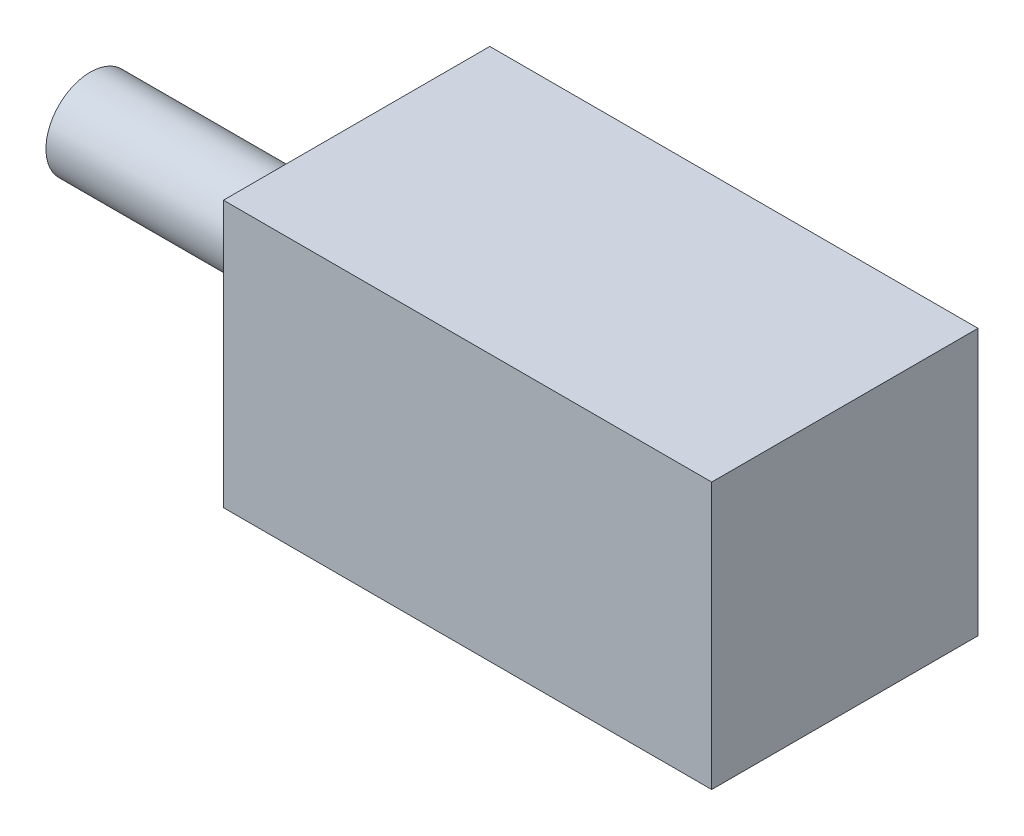
ISO-10303-21;
HEADER;
FILE_DESCRIPTION(('STEP AP214'),'2;1');
FILE_NAME('part.step','',(''),(''),'','','');
FILE_SCHEMA(('AUTOMOTIVE_DESIGN { 1 0 10303 214 1 1 1 1 }'));
ENDSEC;
DATA;
#1=APPLICATION_CONTEXT('core data for automotive mechanical design processes');
#2=APPLICATION_PROTOCOL_DEFINITION('international standard','automotive_design',2000,#1);
#3=PRODUCT_CONTEXT('',#1,'mechanical');
#4=PRODUCT('Part','Part','',(#3));
#5=PRODUCT_RELATED_PRODUCT_CATEGORY('part','',(#4));
#6=PRODUCT_DEFINITION_FORMATION('','',#4);
#7=PRODUCT_DEFINITION_CONTEXT('part definition',#1,'design');
#8=PRODUCT_DEFINITION('design','',#6,#7);
#9=PRODUCT_DEFINITION_SHAPE('','',#8);
#10=(LENGTH_UNIT() NAMED_UNIT(*) SI_UNIT(.MILLI.,.METRE.));
#11=(NAMED_UNIT(*) PLANE_ANGLE_UNIT() SI_UNIT($,.RADIAN.));
#12=(NAMED_UNIT(*) SI_UNIT($,.STERADIAN.) SOLID_ANGLE_UNIT());
#13=UNCERTAINTY_MEASURE_WITH_UNIT(LENGTH_MEASURE(1.E-05),#10,'distance_accuracy_value','');
#14=(GEOMETRIC_REPRESENTATION_CONTEXT(3) GLOBAL_UNCERTAINTY_ASSIGNED_CONTEXT((#13)) GLOBAL_UNIT_ASSIGNED_CONTEXT((#10,
#11,#12)) REPRESENTATION_CONTEXT('',''));
#15=CARTESIAN_POINT('',(0.,0.,0.));
#16=DIRECTION('',(0.,0.,1.));
#17=DIRECTION('',(1.,0.,0.));
#18=AXIS2_PLACEMENT_3D('',#15,#16,#17);
#19=CARTESIAN_POINT('',(0.,-19.05,19.05));
#20=DIRECTION('',(-1.,0.,0.));
#21=DIRECTION('',(0.,0.,1.));
#22=AXIS2_PLACEMENT_3D('',#19,#20,#21);
#23=PLANE('',#22);
#24=CARTESIAN_POINT('',(0.,0.,0.));
#25=DIRECTION('',(-1.,0.,0.));
#26=DIRECTION('',(0.,0.,1.));
#27=AXIS2_PLACEMENT_3D('',#24,#25,#26);
#28=CIRCLE('',#27,6.35);
#29=CARTESIAN_POINT('',(0.,0.,6.35));
#30=VERTEX_POINT('',#29);
#31=EDGE_CURVE('E11',#30,#30,#28,.T.);
#32=ORIENTED_EDGE('',*,*,#31,.F.);
#33=EDGE_LOOP('',(#32));
#34=FACE_BOUND('',#33,.T.);
#35=DIRECTION('',(0.,1.,0.));
#36=VECTOR('',#35,1.);
#37=CARTESIAN_POINT('',(0.,-19.05,19.05));
#38=LINE('',#37,#36);
#39=CARTESIAN_POINT('',(0.,-19.05,19.05));
#40=VERTEX_POINT('',#39);
#41=CARTESIAN_POINT('',(0.,19.05,19.05));
#42=VERTEX_POINT('',#41);
#43=EDGE_CURVE('E71',#40,#42,#38,.T.);
#44=ORIENTED_EDGE('',*,*,#43,.T.);
#45=DIRECTION('',(0.,0.,1.));
#46=VECTOR('',#45,1.);
#47=CARTESIAN_POINT('',(0.,19.05,19.05));
#48=LINE('',#47,#46);
#49=CARTESIAN_POINT('',(0.,19.05,-19.05));
#50=VERTEX_POINT('',#49);
#51=EDGE_CURVE('E74',#50,#42,#48,.T.);
#52=ORIENTED_EDGE('',*,*,#51,.F.);
#53=DIRECTION('',(0.,1.,0.));
#54=VECTOR('',#53,1.);
#55=CARTESIAN_POINT('',(0.,-19.05,-19.05));
#56=LINE('',#55,#54);
#57=CARTESIAN_POINT('',(0.,-19.05,-19.05));
#58=VERTEX_POINT('',#57);
#59=EDGE_CURVE('E40',#58,#50,#56,.T.);
#60=ORIENTED_EDGE('',*,*,#59,.F.);
#61=DIRECTION('',(0.,0.,1.));
#62=VECTOR('',#61,1.);
#63=CARTESIAN_POINT('',(0.,-19.05,19.05));
#64=LINE('',#63,#62);
#65=EDGE_CURVE('E75',#58,#40,#64,.T.);
#66=ORIENTED_EDGE('',*,*,#65,.T.);
#67=EDGE_LOOP('',(#44,#52,#60,#66));
#68=FACE_BOUND('',#67,.T.);
#69=ADVANCED_FACE('F33',(#34,#68),#23,.T.);
#70=CARTESIAN_POINT('',(0.,-19.05,-19.05));
#71=DIRECTION('',(0.,0.,-1.));
#72=DIRECTION('',(-1.,0.,0.));
#73=AXIS2_PLACEMENT_3D('',#70,#71,#72);
#74=PLANE('',#73);
#75=ORIENTED_EDGE('',*,*,#59,.T.);
#76=DIRECTION('',(-1.,0.,0.));
#77=VECTOR('',#76,1.);
#78=CARTESIAN_POINT('',(0.,19.05,-19.05));
#79=LINE('',#78,#77);
#80=CARTESIAN_POINT('',(69.85,19.05,-19.05));
#81=VERTEX_POINT('',#80);
#82=EDGE_CURVE('E91',#81,#50,#79,.T.);
#83=ORIENTED_EDGE('',*,*,#82,.F.);
#84=DIRECTION('',(0.,1.,0.));
#85=VECTOR('',#84,1.);
#86=CARTESIAN_POINT('',(69.85,-19.05,-19.05));
#87=LINE('',#86,#85);
#88=CARTESIAN_POINT('',(69.85,-19.05,-19.05));
#89=VERTEX_POINT('',#88);
#90=EDGE_CURVE('E54',#89,#81,#87,.T.);
#91=ORIENTED_EDGE('',*,*,#90,.F.);
#92=DIRECTION('',(-1.,0.,0.));
#93=VECTOR('',#92,1.);
#94=CARTESIAN_POINT('',(0.,-19.05,-19.05));
#95=LINE('',#94,#93);
#96=EDGE_CURVE('E80',#89,#58,#95,.T.);
#97=ORIENTED_EDGE('',*,*,#96,.T.);
#98=EDGE_LOOP('',(#75,#83,#91,#97));
#99=FACE_BOUND('',#98,.T.);
#100=ADVANCED_FACE('F111',(#99),#74,.T.);
#101=CARTESIAN_POINT('',(69.85,-19.05,19.05));
#102=DIRECTION('',(1.,0.,0.));
#103=DIRECTION('',(0.,0.,-1.));
#104=AXIS2_PLACEMENT_3D('',#101,#102,#103);
#105=PLANE('',#104);
#106=ORIENTED_EDGE('',*,*,#90,.T.);
#107=DIRECTION('',(0.,0.,-1.));
#108=VECTOR('',#107,1.);
#109=CARTESIAN_POINT('',(69.85,19.05,19.05));
#110=LINE('',#109,#108);
#111=CARTESIAN_POINT('',(69.85,19.05,19.05));
#112=VERTEX_POINT('',#111);
#113=EDGE_CURVE('E87',#112,#81,#110,.T.);
#114=ORIENTED_EDGE('',*,*,#113,.F.);
#115=DIRECTION('',(0.,1.,0.));
#116=VECTOR('',#115,1.);
#117=CARTESIAN_POINT('',(69.85,-19.05,19.05));
#118=LINE('',#117,#116);
#119=CARTESIAN_POINT('',(69.85,-19.05,19.05));
#120=VERTEX_POINT('',#119);
#121=EDGE_CURVE('E79',#120,#112,#118,.T.);
#122=ORIENTED_EDGE('',*,*,#121,.F.);
#123=DIRECTION('',(0.,0.,-1.));
#124=VECTOR('',#123,1.);
#125=CARTESIAN_POINT('',(69.85,-19.05,19.05));
#126=LINE('',#125,#124);
#127=EDGE_CURVE('E102',#120,#89,#126,.T.);
#128=ORIENTED_EDGE('',*,*,#127,.T.);
#129=EDGE_LOOP('',(#106,#114,#122,#128));
#130=FACE_BOUND('',#129,.T.);
#131=ADVANCED_FACE('F108',(#130),#105,.T.);
#132=CARTESIAN_POINT('',(0.,-19.05,19.05));
#133=DIRECTION('',(0.,0.,1.));
#134=DIRECTION('',(1.,0.,0.));
#135=AXIS2_PLACEMENT_3D('',#132,#133,#134);
#136=PLANE('',#135);
#137=ORIENTED_EDGE('',*,*,#121,.T.);
#138=DIRECTION('',(1.,0.,0.));
#139=VECTOR('',#138,1.);
#140=CARTESIAN_POINT('',(0.,19.05,19.05));
#141=LINE('',#140,#139);
#142=EDGE_CURVE('E82',#42,#112,#141,.T.);
#143=ORIENTED_EDGE('',*,*,#142,.F.);
#144=ORIENTED_EDGE('',*,*,#43,.F.);
#145=DIRECTION('',(1.,0.,0.));
#146=VECTOR('',#145,1.);
#147=CARTESIAN_POINT('',(0.,-19.05,19.05));
#148=LINE('',#147,#146);
#149=EDGE_CURVE('E100',#40,#120,#148,.T.);
#150=ORIENTED_EDGE('',*,*,#149,.T.);
#151=EDGE_LOOP('',(#137,#143,#144,#150));
#152=FACE_BOUND('',#151,.T.);
#153=ADVANCED_FACE('F83',(#152),#136,.T.);
#154=CARTESIAN_POINT('',(0.,-19.05,0.));
#155=DIRECTION('',(0.,-1.,0.));
#156=DIRECTION('',(0.,0.,-1.));
#157=AXIS2_PLACEMENT_3D('',#154,#155,#156);
#158=PLANE('',#157);
#159=ORIENTED_EDGE('',*,*,#65,.F.);
#160=ORIENTED_EDGE('',*,*,#96,.F.);
#161=ORIENTED_EDGE('',*,*,#127,.F.);
#162=ORIENTED_EDGE('',*,*,#149,.F.);
#163=EDGE_LOOP('',(#159,#160,#161,#162));
#164=FACE_BOUND('',#163,.T.);
#165=ADVANCED_FACE('F113',(#164),#158,.T.);
#166=CARTESIAN_POINT('',(0.,19.05,0.));
#167=DIRECTION('',(0.,-1.,0.));
#168=DIRECTION('',(0.,0.,-1.));
#169=AXIS2_PLACEMENT_3D('',#166,#167,#168);
#170=PLANE('',#169);
#171=ORIENTED_EDGE('',*,*,#51,.T.);
#172=ORIENTED_EDGE('',*,*,#142,.T.);
#173=ORIENTED_EDGE('',*,*,#113,.T.);
#174=ORIENTED_EDGE('',*,*,#82,.T.);
#175=EDGE_LOOP('',(#171,#172,#173,#174));
#176=FACE_BOUND('',#175,.T.);
#177=ADVANCED_FACE('F90',(#176),#170,.F.);
#178=CARTESIAN_POINT('',(0.,0.,0.));
#179=DIRECTION('',(1.,0.,0.));
#180=DIRECTION('',(0.,0.,-1.));
#181=AXIS2_PLACEMENT_3D('',#178,#179,#180);
#182=CYLINDRICAL_SURFACE('',#181,6.35);
#183=CARTESIAN_POINT('',(-38.1,0.,0.));
#184=DIRECTION('',(1.,0.,0.));
#185=DIRECTION('',(0.,0.,-1.));
#186=AXIS2_PLACEMENT_3D('',#183,#184,#185);
#187=CIRCLE('',#186,6.34999999999999);
#188=CARTESIAN_POINT('',(-38.1,0.,-6.34999999999999));
#189=VERTEX_POINT('',#188);
#190=EDGE_CURVE('E92',#189,#189,#187,.T.);
#191=ORIENTED_EDGE('',*,*,#190,.T.);
#192=EDGE_LOOP('',(#191));
#193=FACE_BOUND('',#192,.T.);
#194=ORIENTED_EDGE('',*,*,#31,.T.);
#195=EDGE_LOOP('',(#194));
#196=FACE_BOUND('',#195,.T.);
#197=ADVANCED_FACE('F120',(#193,#196),#182,.T.);
#198=CARTESIAN_POINT('',(-38.1,0.,0.));
#199=DIRECTION('',(-1.,0.,0.));
#200=DIRECTION('',(0.,0.,1.));
#201=AXIS2_PLACEMENT_3D('',#198,#199,#200);
#202=PLANE('',#201);
#203=ORIENTED_EDGE('',*,*,#190,.F.);
#204=EDGE_LOOP('',(#203));
#205=FACE_BOUND('',#204,.T.);
#206=ADVANCED_FACE('F131',(#205),#202,.T.);
#207=CLOSED_SHELL('',(#69,#100,#131,#153,#165,#177,#197,#206));
#208=MANIFOLD_SOLID_BREP('B2',#207);
#209=ADVANCED_BREP_SHAPE_REPRESENTATION('',(#18,#208),#14);
#210=SHAPE_DEFINITION_REPRESENTATION(#9,#209);
ENDSEC;
END-ISO-10303-21;
